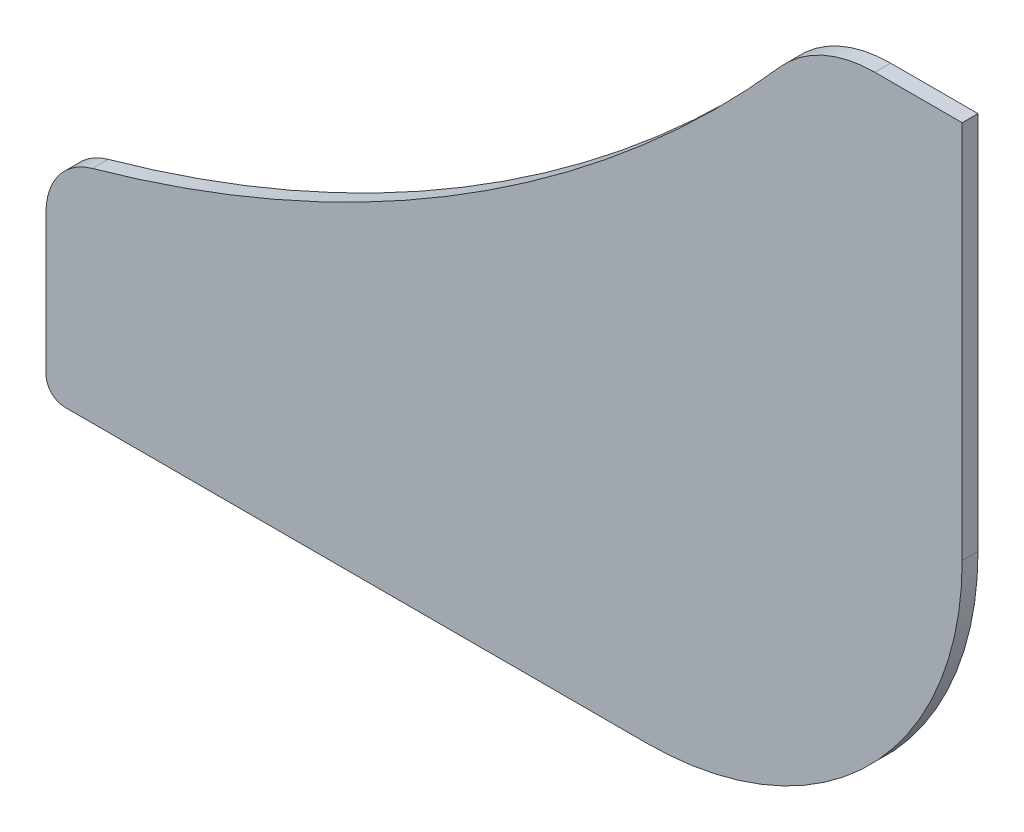
ISO-10303-21;
HEADER;
FILE_DESCRIPTION(('STEP AP214'),'2;1');
FILE_NAME('part.step','',(''),(''),'','','');
FILE_SCHEMA(('AUTOMOTIVE_DESIGN { 1 0 10303 214 1 1 1 1 }'));
ENDSEC;
DATA;
#1=APPLICATION_CONTEXT('core data for automotive mechanical design processes');
#2=APPLICATION_PROTOCOL_DEFINITION('international standard','automotive_design',2000,#1);
#3=PRODUCT_CONTEXT('',#1,'mechanical');
#4=PRODUCT('Part','Part','',(#3));
#5=PRODUCT_RELATED_PRODUCT_CATEGORY('part','',(#4));
#6=PRODUCT_DEFINITION_FORMATION('','',#4);
#7=PRODUCT_DEFINITION_CONTEXT('part definition',#1,'design');
#8=PRODUCT_DEFINITION('design','',#6,#7);
#9=PRODUCT_DEFINITION_SHAPE('','',#8);
#10=(LENGTH_UNIT() NAMED_UNIT(*) SI_UNIT(.MILLI.,.METRE.));
#11=(NAMED_UNIT(*) PLANE_ANGLE_UNIT() SI_UNIT($,.RADIAN.));
#12=(NAMED_UNIT(*) SI_UNIT($,.STERADIAN.) SOLID_ANGLE_UNIT());
#13=UNCERTAINTY_MEASURE_WITH_UNIT(LENGTH_MEASURE(1.E-05),#10,'distance_accuracy_value','');
#14=(GEOMETRIC_REPRESENTATION_CONTEXT(3) GLOBAL_UNCERTAINTY_ASSIGNED_CONTEXT((#13)) GLOBAL_UNIT_ASSIGNED_CONTEXT((#10,
#11,#12)) REPRESENTATION_CONTEXT('',''));
#15=CARTESIAN_POINT('',(0.,0.,0.));
#16=DIRECTION('',(0.,0.,1.));
#17=DIRECTION('',(1.,0.,0.));
#18=AXIS2_PLACEMENT_3D('',#15,#16,#17);
#19=CARTESIAN_POINT('',(0.,-7.62000000000002,6.35));
#20=DIRECTION('',(0.,-1.,0.));
#21=DIRECTION('',(0.,0.,-1.));
#22=AXIS2_PLACEMENT_3D('',#19,#20,#21);
#23=PLANE('',#22);
#24=DIRECTION('',(-1.,0.,0.));
#25=VECTOR('',#24,1.);
#26=CARTESIAN_POINT('',(0.,-7.62000000000002,0.));
#27=LINE('',#26,#25);
#28=CARTESIAN_POINT('',(571.471225938193,-7.62000000000002,0.));
#29=VERTEX_POINT('',#28);
#30=CARTESIAN_POINT('',(536.34638307089,-7.62000000000002,0.));
#31=VERTEX_POINT('',#30);
#32=EDGE_CURVE('E129',#29,#31,#27,.T.);
#33=ORIENTED_EDGE('',*,*,#32,.T.);
#34=DIRECTION('',(0.,0.,-1.));
#35=VECTOR('',#34,1.);
#36=CARTESIAN_POINT('',(536.34638307089,-7.62000000000002,6.35));
#37=LINE('',#36,#35);
#38=CARTESIAN_POINT('',(536.34638307089,-7.62000000000002,6.35));
#39=VERTEX_POINT('',#38);
#40=EDGE_CURVE('E110',#39,#31,#37,.T.);
#41=ORIENTED_EDGE('',*,*,#40,.F.);
#42=DIRECTION('',(-1.,0.,0.));
#43=VECTOR('',#42,1.);
#44=CARTESIAN_POINT('',(0.,-7.62000000000002,6.35));
#45=LINE('',#44,#43);
#46=CARTESIAN_POINT('',(571.471225938193,-7.62000000000002,6.35));
#47=VERTEX_POINT('',#46);
#48=EDGE_CURVE('E116',#47,#39,#45,.T.);
#49=ORIENTED_EDGE('',*,*,#48,.F.);
#50=DIRECTION('',(0.,0.,-1.));
#51=VECTOR('',#50,1.);
#52=CARTESIAN_POINT('',(571.471225938193,-7.62000000000002,6.35));
#53=LINE('',#52,#51);
#54=EDGE_CURVE('E147',#47,#29,#53,.T.);
#55=ORIENTED_EDGE('',*,*,#54,.T.);
#56=EDGE_LOOP('',(#33,#41,#49,#55));
#57=FACE_BOUND('',#56,.T.);
#58=ADVANCED_FACE('F35',(#57),#23,.F.);
#59=CARTESIAN_POINT('',(536.34638307089,-58.42,6.35));
#60=DIRECTION('',(0.,0.,-1.));
#61=DIRECTION('',(-1.,0.,0.));
#62=AXIS2_PLACEMENT_3D('',#59,#60,#61);
#63=CYLINDRICAL_SURFACE('',#62,50.8000000000001);
#64=CARTESIAN_POINT('',(536.34638307089,-58.42,0.));
#65=DIRECTION('',(0.,0.,1.));
#66=DIRECTION('',(1.,0.,0.));
#67=AXIS2_PLACEMENT_3D('',#64,#65,#66);
#68=CIRCLE('',#67,50.8000000000001);
#69=CARTESIAN_POINT('',(498.198486457985,-24.8733461577603,0.));
#70=VERTEX_POINT('',#69);
#71=EDGE_CURVE('E162',#31,#70,#68,.T.);
#72=ORIENTED_EDGE('',*,*,#71,.T.);
#73=DIRECTION('',(0.,0.,-1.));
#74=VECTOR('',#73,1.);
#75=CARTESIAN_POINT('',(498.198486457985,-24.8733461577603,6.35));
#76=LINE('',#75,#74);
#77=CARTESIAN_POINT('',(498.198486457985,-24.8733461577603,6.35));
#78=VERTEX_POINT('',#77);
#79=EDGE_CURVE('E113',#78,#70,#76,.T.);
#80=ORIENTED_EDGE('',*,*,#79,.F.);
#81=CARTESIAN_POINT('',(536.34638307089,-58.42,6.35));
#82=DIRECTION('',(0.,0.,1.));
#83=DIRECTION('',(1.,0.,0.));
#84=AXIS2_PLACEMENT_3D('',#81,#82,#83);
#85=CIRCLE('',#84,50.8000000000001);
#86=EDGE_CURVE('E105',#39,#78,#85,.T.);
#87=ORIENTED_EDGE('',*,*,#86,.F.);
#88=ORIENTED_EDGE('',*,*,#40,.T.);
#89=EDGE_LOOP('',(#72,#80,#87,#88));
#90=FACE_BOUND('',#89,.T.);
#91=ADVANCED_FACE('F108',(#90),#63,.T.);
#92=CARTESIAN_POINT('',(68.2384296997134,353.226692657483,6.35));
#93=DIRECTION('',(0.,0.,-1.));
#94=DIRECTION('',(-1.,0.,0.));
#95=AXIS2_PLACEMENT_3D('',#92,#93,#94);
#96=CYLINDRICAL_SURFACE('',#95,572.560293558385);
#97=CARTESIAN_POINT('',(68.2384296997134,353.226692657483,0.));
#98=DIRECTION('',(0.,0.,1.));
#99=DIRECTION('',(1.,0.,0.));
#100=AXIS2_PLACEMENT_3D('',#97,#98,#99);
#101=CIRCLE('',#100,572.560293558385);
#102=CARTESIAN_POINT('',(221.788203414999,-198.359888716329,0.));
#103=VERTEX_POINT('',#102);
#104=EDGE_CURVE('E160',#103,#70,#101,.T.);
#105=ORIENTED_EDGE('',*,*,#104,.F.);
#106=DIRECTION('',(0.,0.,-1.));
#107=VECTOR('',#106,1.);
#108=CARTESIAN_POINT('',(221.788203414999,-198.359888716329,6.35));
#109=LINE('',#108,#107);
#110=CARTESIAN_POINT('',(221.788203414999,-198.359888716329,6.35));
#111=VERTEX_POINT('',#110);
#112=EDGE_CURVE('E43',#103,#111,#109,.F.);
#113=ORIENTED_EDGE('',*,*,#112,.T.);
#114=CARTESIAN_POINT('',(68.2384296997134,353.226692657483,6.35));
#115=DIRECTION('',(0.,0.,1.));
#116=DIRECTION('',(1.,0.,0.));
#117=AXIS2_PLACEMENT_3D('',#114,#115,#116);
#118=CIRCLE('',#117,572.560293558385);
#119=EDGE_CURVE('E115',#111,#78,#118,.T.);
#120=ORIENTED_EDGE('',*,*,#119,.T.);
#121=ORIENTED_EDGE('',*,*,#79,.T.);
#122=EDGE_LOOP('',(#105,#113,#120,#121));
#123=FACE_BOUND('',#122,.T.);
#124=ADVANCED_FACE('F175',(#123),#96,.F.);
#125=CARTESIAN_POINT('',(203.2,0.,6.35));
#126=DIRECTION('',(1.,0.,0.));
#127=DIRECTION('',(0.,0.,-1.));
#128=AXIS2_PLACEMENT_3D('',#125,#126,#127);
#129=PLANE('',#128);
#130=DIRECTION('',(0.,-1.,0.));
#131=VECTOR('',#130,1.);
#132=CARTESIAN_POINT('',(203.2,0.,6.35));
#133=LINE('',#132,#131);
#134=CARTESIAN_POINT('',(203.2,-222.829449956461,6.35));
#135=VERTEX_POINT('',#134);
#136=CARTESIAN_POINT('',(203.2,-279.4,6.35));
#137=VERTEX_POINT('',#136);
#138=EDGE_CURVE('E173',#135,#137,#133,.T.);
#139=ORIENTED_EDGE('',*,*,#138,.F.);
#140=DIRECTION('',(0.,0.,1.));
#141=VECTOR('',#140,1.);
#142=CARTESIAN_POINT('',(203.2,-222.829449956461,0.));
#143=LINE('',#142,#141);
#144=CARTESIAN_POINT('',(203.2,-222.829449956461,0.));
#145=VERTEX_POINT('',#144);
#146=EDGE_CURVE('E130',#135,#145,#143,.F.);
#147=ORIENTED_EDGE('',*,*,#146,.T.);
#148=DIRECTION('',(0.,-1.,0.));
#149=VECTOR('',#148,1.);
#150=CARTESIAN_POINT('',(203.2,0.,0.));
#151=LINE('',#150,#149);
#152=CARTESIAN_POINT('',(203.2,-279.4,0.));
#153=VERTEX_POINT('',#152);
#154=EDGE_CURVE('E158',#145,#153,#151,.T.);
#155=ORIENTED_EDGE('',*,*,#154,.T.);
#156=DIRECTION('',(0.,0.,-1.));
#157=VECTOR('',#156,1.);
#158=CARTESIAN_POINT('',(203.2,-279.4,6.35));
#159=LINE('',#158,#157);
#160=EDGE_CURVE('E134',#137,#153,#159,.T.);
#161=ORIENTED_EDGE('',*,*,#160,.F.);
#162=EDGE_LOOP('',(#139,#147,#155,#161));
#163=FACE_BOUND('',#162,.T.);
#164=ADVANCED_FACE('F181',(#163),#129,.F.);
#165=CARTESIAN_POINT('',(210.82,-279.4,6.35));
#166=DIRECTION('',(0.,0.,-1.));
#167=DIRECTION('',(-1.,0.,0.));
#168=AXIS2_PLACEMENT_3D('',#165,#166,#167);
#169=CYLINDRICAL_SURFACE('',#168,7.61999999999993);
#170=CARTESIAN_POINT('',(210.82,-279.4,0.));
#171=DIRECTION('',(0.,0.,1.));
#172=DIRECTION('',(1.,0.,0.));
#173=AXIS2_PLACEMENT_3D('',#170,#171,#172);
#174=CIRCLE('',#173,7.61999999999993);
#175=CARTESIAN_POINT('',(210.82,-287.02,0.));
#176=VERTEX_POINT('',#175);
#177=EDGE_CURVE('E156',#153,#176,#174,.T.);
#178=ORIENTED_EDGE('',*,*,#177,.T.);
#179=DIRECTION('',(0.,0.,-1.));
#180=VECTOR('',#179,1.);
#181=CARTESIAN_POINT('',(210.82,-287.02,6.35));
#182=LINE('',#181,#180);
#183=CARTESIAN_POINT('',(210.82,-287.02,6.35));
#184=VERTEX_POINT('',#183);
#185=EDGE_CURVE('E140',#184,#176,#182,.T.);
#186=ORIENTED_EDGE('',*,*,#185,.F.);
#187=CARTESIAN_POINT('',(210.82,-279.4,6.35));
#188=DIRECTION('',(0.,0.,1.));
#189=DIRECTION('',(1.,0.,0.));
#190=AXIS2_PLACEMENT_3D('',#187,#188,#189);
#191=CIRCLE('',#190,7.61999999999993);
#192=EDGE_CURVE('E171',#137,#184,#191,.T.);
#193=ORIENTED_EDGE('',*,*,#192,.F.);
#194=ORIENTED_EDGE('',*,*,#160,.T.);
#195=EDGE_LOOP('',(#178,#186,#193,#194));
#196=FACE_BOUND('',#195,.T.);
#197=ADVANCED_FACE('F188',(#196),#169,.T.);
#198=CARTESIAN_POINT('',(-1.36381142982834E-13,-287.02,6.35));
#199=DIRECTION('',(0.,1.,0.));
#200=DIRECTION('',(-1.,0.,0.));
#201=AXIS2_PLACEMENT_3D('',#198,#199,#200);
#202=PLANE('',#201);
#203=DIRECTION('',(1.,0.,0.));
#204=VECTOR('',#203,1.);
#205=CARTESIAN_POINT('',(-1.36381142982834E-13,-287.02,0.));
#206=LINE('',#205,#204);
#207=CARTESIAN_POINT('',(444.471225938193,-287.02,0.));
#208=VERTEX_POINT('',#207);
#209=EDGE_CURVE('E153',#176,#208,#206,.T.);
#210=ORIENTED_EDGE('',*,*,#209,.T.);
#211=DIRECTION('',(0.,0.,-1.));
#212=VECTOR('',#211,1.);
#213=CARTESIAN_POINT('',(444.471225938193,-287.02,6.35));
#214=LINE('',#213,#212);
#215=CARTESIAN_POINT('',(444.471225938193,-287.02,6.35));
#216=VERTEX_POINT('',#215);
#217=EDGE_CURVE('E143',#216,#208,#214,.T.);
#218=ORIENTED_EDGE('',*,*,#217,.F.);
#219=DIRECTION('',(1.,0.,0.));
#220=VECTOR('',#219,1.);
#221=CARTESIAN_POINT('',(-1.36381142982834E-13,-287.02,6.35));
#222=LINE('',#221,#220);
#223=EDGE_CURVE('E169',#184,#216,#222,.T.);
#224=ORIENTED_EDGE('',*,*,#223,.F.);
#225=ORIENTED_EDGE('',*,*,#185,.T.);
#226=EDGE_LOOP('',(#210,#218,#224,#225));
#227=FACE_BOUND('',#226,.T.);
#228=ADVANCED_FACE('F192',(#227),#202,.F.);
#229=CARTESIAN_POINT('',(444.471225938193,-160.02,6.35));
#230=DIRECTION('',(0.,0.,-1.));
#231=DIRECTION('',(-1.,0.,0.));
#232=AXIS2_PLACEMENT_3D('',#229,#230,#231);
#233=CYLINDRICAL_SURFACE('',#232,127.);
#234=CARTESIAN_POINT('',(444.471225938193,-160.02,0.));
#235=DIRECTION('',(0.,0.,1.));
#236=DIRECTION('',(1.,0.,0.));
#237=AXIS2_PLACEMENT_3D('',#234,#235,#236);
#238=CIRCLE('',#237,127.);
#239=CARTESIAN_POINT('',(571.471225938193,-160.02,0.));
#240=VERTEX_POINT('',#239);
#241=EDGE_CURVE('E150',#240,#208,#238,.F.);
#242=ORIENTED_EDGE('',*,*,#241,.F.);
#243=DIRECTION('',(0.,0.,-1.));
#244=VECTOR('',#243,1.);
#245=CARTESIAN_POINT('',(571.471225938193,-160.02,6.35));
#246=LINE('',#245,#244);
#247=CARTESIAN_POINT('',(571.471225938193,-160.02,6.35));
#248=VERTEX_POINT('',#247);
#249=EDGE_CURVE('E145',#248,#240,#246,.T.);
#250=ORIENTED_EDGE('',*,*,#249,.F.);
#251=CARTESIAN_POINT('',(444.471225938193,-160.02,6.35));
#252=DIRECTION('',(0.,0.,1.));
#253=DIRECTION('',(1.,0.,0.));
#254=AXIS2_PLACEMENT_3D('',#251,#252,#253);
#255=CIRCLE('',#254,127.);
#256=EDGE_CURVE('E166',#248,#216,#255,.F.);
#257=ORIENTED_EDGE('',*,*,#256,.T.);
#258=ORIENTED_EDGE('',*,*,#217,.T.);
#259=EDGE_LOOP('',(#242,#250,#257,#258));
#260=FACE_BOUND('',#259,.T.);
#261=ADVANCED_FACE('F196',(#260),#233,.T.);
#262=CARTESIAN_POINT('',(571.471225938193,0.,6.35));
#263=DIRECTION('',(-1.,0.,0.));
#264=DIRECTION('',(0.,0.,1.));
#265=AXIS2_PLACEMENT_3D('',#262,#263,#264);
#266=PLANE('',#265);
#267=DIRECTION('',(0.,1.,0.));
#268=VECTOR('',#267,1.);
#269=CARTESIAN_POINT('',(571.471225938193,0.,0.));
#270=LINE('',#269,#268);
#271=EDGE_CURVE('E126',#240,#29,#270,.T.);
#272=ORIENTED_EDGE('',*,*,#271,.T.);
#273=ORIENTED_EDGE('',*,*,#54,.F.);
#274=DIRECTION('',(0.,1.,0.));
#275=VECTOR('',#274,1.);
#276=CARTESIAN_POINT('',(571.471225938193,0.,6.35));
#277=LINE('',#276,#275);
#278=EDGE_CURVE('E122',#248,#47,#277,.T.);
#279=ORIENTED_EDGE('',*,*,#278,.F.);
#280=ORIENTED_EDGE('',*,*,#249,.T.);
#281=EDGE_LOOP('',(#272,#273,#279,#280));
#282=FACE_BOUND('',#281,.T.);
#283=ADVANCED_FACE('F199',(#282),#266,.F.);
#284=CARTESIAN_POINT('',(0.,0.,6.35));
#285=DIRECTION('',(0.,0.,1.));
#286=DIRECTION('',(1.,0.,0.));
#287=AXIS2_PLACEMENT_3D('',#284,#285,#286);
#288=PLANE('',#287);
#289=ORIENTED_EDGE('',*,*,#119,.F.);
#290=CARTESIAN_POINT('',(228.6,-222.829449956461,6.35));
#291=DIRECTION('',(0.,0.,1.));
#292=DIRECTION('',(1.,0.,0.));
#293=AXIS2_PLACEMENT_3D('',#290,#291,#292);
#294=CIRCLE('',#293,25.4);
#295=EDGE_CURVE('E11',#111,#135,#294,.T.);
#296=ORIENTED_EDGE('',*,*,#295,.T.);
#297=ORIENTED_EDGE('',*,*,#138,.T.);
#298=ORIENTED_EDGE('',*,*,#192,.T.);
#299=ORIENTED_EDGE('',*,*,#223,.T.);
#300=ORIENTED_EDGE('',*,*,#256,.F.);
#301=ORIENTED_EDGE('',*,*,#278,.T.);
#302=ORIENTED_EDGE('',*,*,#48,.T.);
#303=ORIENTED_EDGE('',*,*,#86,.T.);
#304=EDGE_LOOP('',(#289,#296,#297,#298,#299,#300,#301,#302,#303));
#305=FACE_BOUND('',#304,.T.);
#306=ADVANCED_FACE('F119',(#305),#288,.T.);
#307=CARTESIAN_POINT('',(0.,0.,0.));
#308=DIRECTION('',(0.,0.,1.));
#309=DIRECTION('',(1.,0.,0.));
#310=AXIS2_PLACEMENT_3D('',#307,#308,#309);
#311=PLANE('',#310);
#312=ORIENTED_EDGE('',*,*,#154,.F.);
#313=CARTESIAN_POINT('',(228.6,-222.829449956461,0.));
#314=DIRECTION('',(0.,0.,1.));
#315=DIRECTION('',(1.,0.,0.));
#316=AXIS2_PLACEMENT_3D('',#313,#314,#315);
#317=CIRCLE('',#316,25.4);
#318=EDGE_CURVE('E57',#145,#103,#317,.F.);
#319=ORIENTED_EDGE('',*,*,#318,.T.);
#320=ORIENTED_EDGE('',*,*,#104,.T.);
#321=ORIENTED_EDGE('',*,*,#71,.F.);
#322=ORIENTED_EDGE('',*,*,#32,.F.);
#323=ORIENTED_EDGE('',*,*,#271,.F.);
#324=ORIENTED_EDGE('',*,*,#241,.T.);
#325=ORIENTED_EDGE('',*,*,#209,.F.);
#326=ORIENTED_EDGE('',*,*,#177,.F.);
#327=EDGE_LOOP('',(#312,#319,#320,#321,#322,#323,#324,#325,#326));
#328=FACE_BOUND('',#327,.T.);
#329=ADVANCED_FACE('F184',(#328),#311,.F.);
#330=CARTESIAN_POINT('',(228.6,-222.829449956461,6.35));
#331=DIRECTION('',(0.,0.,-1.));
#332=DIRECTION('',(-1.,0.,0.));
#333=AXIS2_PLACEMENT_3D('',#330,#331,#332);
#334=CYLINDRICAL_SURFACE('',#333,25.4);
#335=ORIENTED_EDGE('',*,*,#295,.F.);
#336=ORIENTED_EDGE('',*,*,#112,.F.);
#337=ORIENTED_EDGE('',*,*,#318,.F.);
#338=ORIENTED_EDGE('',*,*,#146,.F.);
#339=EDGE_LOOP('',(#335,#336,#337,#338));
#340=FACE_BOUND('',#339,.T.);
#341=ADVANCED_FACE('F37',(#340),#334,.T.);
#342=CLOSED_SHELL('',(#58,#91,#124,#164,#197,#228,#261,#283,#306,#329,#341));
#343=MANIFOLD_SOLID_BREP('B2',#342);
#344=ADVANCED_BREP_SHAPE_REPRESENTATION('',(#18,#343),#14);
#345=SHAPE_DEFINITION_REPRESENTATION(#9,#344);
ENDSEC;
END-ISO-10303-21;
